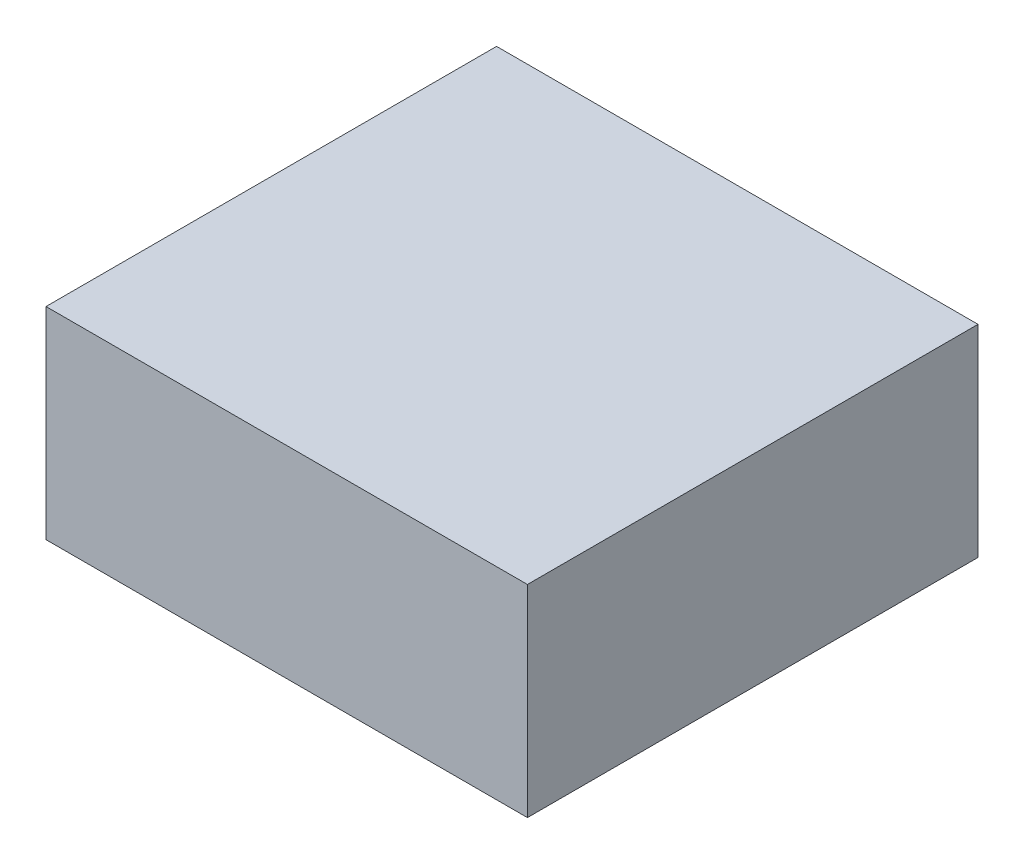
ISO-10303-21;
HEADER;
FILE_DESCRIPTION(('STEP AP214'),'2;1');
FILE_NAME('part.step','',(''),(''),'','','');
FILE_SCHEMA(('AUTOMOTIVE_DESIGN { 1 0 10303 214 1 1 1 1 }'));
ENDSEC;
DATA;
#1=APPLICATION_CONTEXT('core data for automotive mechanical design processes');
#2=APPLICATION_PROTOCOL_DEFINITION('international standard','automotive_design',2000,#1);
#3=PRODUCT_CONTEXT('',#1,'mechanical');
#4=PRODUCT('Part','Part','',(#3));
#5=PRODUCT_RELATED_PRODUCT_CATEGORY('part','',(#4));
#6=PRODUCT_DEFINITION_FORMATION('','',#4);
#7=PRODUCT_DEFINITION_CONTEXT('part definition',#1,'design');
#8=PRODUCT_DEFINITION('design','',#6,#7);
#9=PRODUCT_DEFINITION_SHAPE('','',#8);
#10=(LENGTH_UNIT() NAMED_UNIT(*) SI_UNIT(.MILLI.,.METRE.));
#11=(NAMED_UNIT(*) PLANE_ANGLE_UNIT() SI_UNIT($,.RADIAN.));
#12=(NAMED_UNIT(*) SI_UNIT($,.STERADIAN.) SOLID_ANGLE_UNIT());
#13=UNCERTAINTY_MEASURE_WITH_UNIT(LENGTH_MEASURE(1.E-05),#10,'distance_accuracy_value','');
#14=(GEOMETRIC_REPRESENTATION_CONTEXT(3) GLOBAL_UNCERTAINTY_ASSIGNED_CONTEXT((#13)) GLOBAL_UNIT_ASSIGNED_CONTEXT((#10,
#11,#12)) REPRESENTATION_CONTEXT('',''));
#15=CARTESIAN_POINT('',(0.,0.,0.));
#16=DIRECTION('',(0.,0.,1.));
#17=DIRECTION('',(1.,0.,0.));
#18=AXIS2_PLACEMENT_3D('',#15,#16,#17);
#19=CARTESIAN_POINT('',(0.,21.6,-24.1));
#20=DIRECTION('',(0.,0.,1.));
#21=DIRECTION('',(1.,0.,0.));
#22=AXIS2_PLACEMENT_3D('',#19,#20,#21);
#23=PLANE('',#22);
#24=DIRECTION('',(-1.,0.,0.));
#25=VECTOR('',#24,1.);
#26=CARTESIAN_POINT('',(0.,0.,-24.1));
#27=LINE('',#26,#25);
#28=CARTESIAN_POINT('',(25.75,0.,-24.1));
#29=VERTEX_POINT('',#28);
#30=CARTESIAN_POINT('',(-25.75,0.,-24.1));
#31=VERTEX_POINT('',#30);
#32=EDGE_CURVE('E109',#29,#31,#27,.T.);
#33=ORIENTED_EDGE('',*,*,#32,.T.);
#34=DIRECTION('',(0.,-1.,0.));
#35=VECTOR('',#34,1.);
#36=CARTESIAN_POINT('',(-25.75,21.6,-24.1));
#37=LINE('',#36,#35);
#38=CARTESIAN_POINT('',(-25.75,21.6,-24.1));
#39=VERTEX_POINT('',#38);
#40=EDGE_CURVE('E11',#39,#31,#37,.T.);
#41=ORIENTED_EDGE('',*,*,#40,.F.);
#42=DIRECTION('',(-1.,0.,0.));
#43=VECTOR('',#42,1.);
#44=CARTESIAN_POINT('',(0.,21.6,-24.1));
#45=LINE('',#44,#43);
#46=CARTESIAN_POINT('',(25.75,21.6,-24.1));
#47=VERTEX_POINT('',#46);
#48=EDGE_CURVE('E91',#47,#39,#45,.T.);
#49=ORIENTED_EDGE('',*,*,#48,.F.);
#50=DIRECTION('',(0.,-1.,0.));
#51=VECTOR('',#50,1.);
#52=CARTESIAN_POINT('',(25.75,21.6,-24.1));
#53=LINE('',#52,#51);
#54=EDGE_CURVE('E58',#47,#29,#53,.T.);
#55=ORIENTED_EDGE('',*,*,#54,.T.);
#56=EDGE_LOOP('',(#33,#41,#49,#55));
#57=FACE_BOUND('',#56,.T.);
#58=ADVANCED_FACE('F41',(#57),#23,.F.);
#59=CARTESIAN_POINT('',(-25.75,21.6,0.));
#60=DIRECTION('',(1.,0.,0.));
#61=DIRECTION('',(0.,0.,-1.));
#62=AXIS2_PLACEMENT_3D('',#59,#60,#61);
#63=PLANE('',#62);
#64=DIRECTION('',(0.,0.,1.));
#65=VECTOR('',#64,1.);
#66=CARTESIAN_POINT('',(-25.75,0.,0.));
#67=LINE('',#66,#65);
#68=CARTESIAN_POINT('',(-25.75,0.,24.1));
#69=VERTEX_POINT('',#68);
#70=EDGE_CURVE('E97',#31,#69,#67,.T.);
#71=ORIENTED_EDGE('',*,*,#70,.T.);
#72=DIRECTION('',(0.,-1.,0.));
#73=VECTOR('',#72,1.);
#74=CARTESIAN_POINT('',(-25.75,21.6,24.1));
#75=LINE('',#74,#73);
#76=CARTESIAN_POINT('',(-25.75,21.6,24.1));
#77=VERTEX_POINT('',#76);
#78=EDGE_CURVE('E50',#77,#69,#75,.T.);
#79=ORIENTED_EDGE('',*,*,#78,.F.);
#80=DIRECTION('',(0.,0.,1.));
#81=VECTOR('',#80,1.);
#82=CARTESIAN_POINT('',(-25.75,21.6,0.));
#83=LINE('',#82,#81);
#84=EDGE_CURVE('E83',#39,#77,#83,.T.);
#85=ORIENTED_EDGE('',*,*,#84,.F.);
#86=ORIENTED_EDGE('',*,*,#40,.T.);
#87=EDGE_LOOP('',(#71,#79,#85,#86));
#88=FACE_BOUND('',#87,.T.);
#89=ADVANCED_FACE('F96',(#88),#63,.F.);
#90=CARTESIAN_POINT('',(0.,21.6,24.1));
#91=DIRECTION('',(0.,0.,1.));
#92=DIRECTION('',(1.,0.,0.));
#93=AXIS2_PLACEMENT_3D('',#90,#91,#92);
#94=PLANE('',#93);
#95=DIRECTION('',(-1.,0.,0.));
#96=VECTOR('',#95,1.);
#97=CARTESIAN_POINT('',(0.,0.,24.1));
#98=LINE('',#97,#96);
#99=CARTESIAN_POINT('',(25.75,0.,24.1));
#100=VERTEX_POINT('',#99);
#101=EDGE_CURVE('E114',#100,#69,#98,.T.);
#102=ORIENTED_EDGE('',*,*,#101,.F.);
#103=DIRECTION('',(0.,-1.,0.));
#104=VECTOR('',#103,1.);
#105=CARTESIAN_POINT('',(25.75,21.6,24.1));
#106=LINE('',#105,#104);
#107=CARTESIAN_POINT('',(25.75,21.6,24.1));
#108=VERTEX_POINT('',#107);
#109=EDGE_CURVE('E72',#108,#100,#106,.T.);
#110=ORIENTED_EDGE('',*,*,#109,.F.);
#111=DIRECTION('',(-1.,0.,0.));
#112=VECTOR('',#111,1.);
#113=CARTESIAN_POINT('',(0.,21.6,24.1));
#114=LINE('',#113,#112);
#115=EDGE_CURVE('E90',#108,#77,#114,.T.);
#116=ORIENTED_EDGE('',*,*,#115,.T.);
#117=ORIENTED_EDGE('',*,*,#78,.T.);
#118=EDGE_LOOP('',(#102,#110,#116,#117));
#119=FACE_BOUND('',#118,.T.);
#120=ADVANCED_FACE('F101',(#119),#94,.T.);
#121=CARTESIAN_POINT('',(25.75,21.6,0.));
#122=DIRECTION('',(1.,0.,0.));
#123=DIRECTION('',(0.,0.,-1.));
#124=AXIS2_PLACEMENT_3D('',#121,#122,#123);
#125=PLANE('',#124);
#126=DIRECTION('',(0.,0.,1.));
#127=VECTOR('',#126,1.);
#128=CARTESIAN_POINT('',(25.75,0.,0.));
#129=LINE('',#128,#127);
#130=EDGE_CURVE('E117',#29,#100,#129,.T.);
#131=ORIENTED_EDGE('',*,*,#130,.F.);
#132=ORIENTED_EDGE('',*,*,#54,.F.);
#133=DIRECTION('',(0.,0.,1.));
#134=VECTOR('',#133,1.);
#135=CARTESIAN_POINT('',(25.75,21.6,0.));
#136=LINE('',#135,#134);
#137=EDGE_CURVE('E103',#47,#108,#136,.T.);
#138=ORIENTED_EDGE('',*,*,#137,.T.);
#139=ORIENTED_EDGE('',*,*,#109,.T.);
#140=EDGE_LOOP('',(#131,#132,#138,#139));
#141=FACE_BOUND('',#140,.T.);
#142=ADVANCED_FACE('F127',(#141),#125,.T.);
#143=CARTESIAN_POINT('',(0.,21.6,0.));
#144=DIRECTION('',(0.,1.,0.));
#145=DIRECTION('',(0.,0.,1.));
#146=AXIS2_PLACEMENT_3D('',#143,#144,#145);
#147=PLANE('',#146);
#148=ORIENTED_EDGE('',*,*,#48,.T.);
#149=ORIENTED_EDGE('',*,*,#84,.T.);
#150=ORIENTED_EDGE('',*,*,#115,.F.);
#151=ORIENTED_EDGE('',*,*,#137,.F.);
#152=EDGE_LOOP('',(#148,#149,#150,#151));
#153=FACE_BOUND('',#152,.T.);
#154=ADVANCED_FACE('F87',(#153),#147,.T.);
#155=CARTESIAN_POINT('',(0.,0.,0.));
#156=DIRECTION('',(0.,1.,0.));
#157=DIRECTION('',(0.,0.,1.));
#158=AXIS2_PLACEMENT_3D('',#155,#156,#157);
#159=PLANE('',#158);
#160=ORIENTED_EDGE('',*,*,#32,.F.);
#161=ORIENTED_EDGE('',*,*,#130,.T.);
#162=ORIENTED_EDGE('',*,*,#101,.T.);
#163=ORIENTED_EDGE('',*,*,#70,.F.);
#164=EDGE_LOOP('',(#160,#161,#162,#163));
#165=FACE_BOUND('',#164,.T.);
#166=ADVANCED_FACE('F126',(#165),#159,.F.);
#167=CLOSED_SHELL('',(#58,#89,#120,#142,#154,#166));
#168=MANIFOLD_SOLID_BREP('B2',#167);
#169=ADVANCED_BREP_SHAPE_REPRESENTATION('',(#18,#168),#14);
#170=SHAPE_DEFINITION_REPRESENTATION(#9,#169);
ENDSEC;
END-ISO-10303-21;
